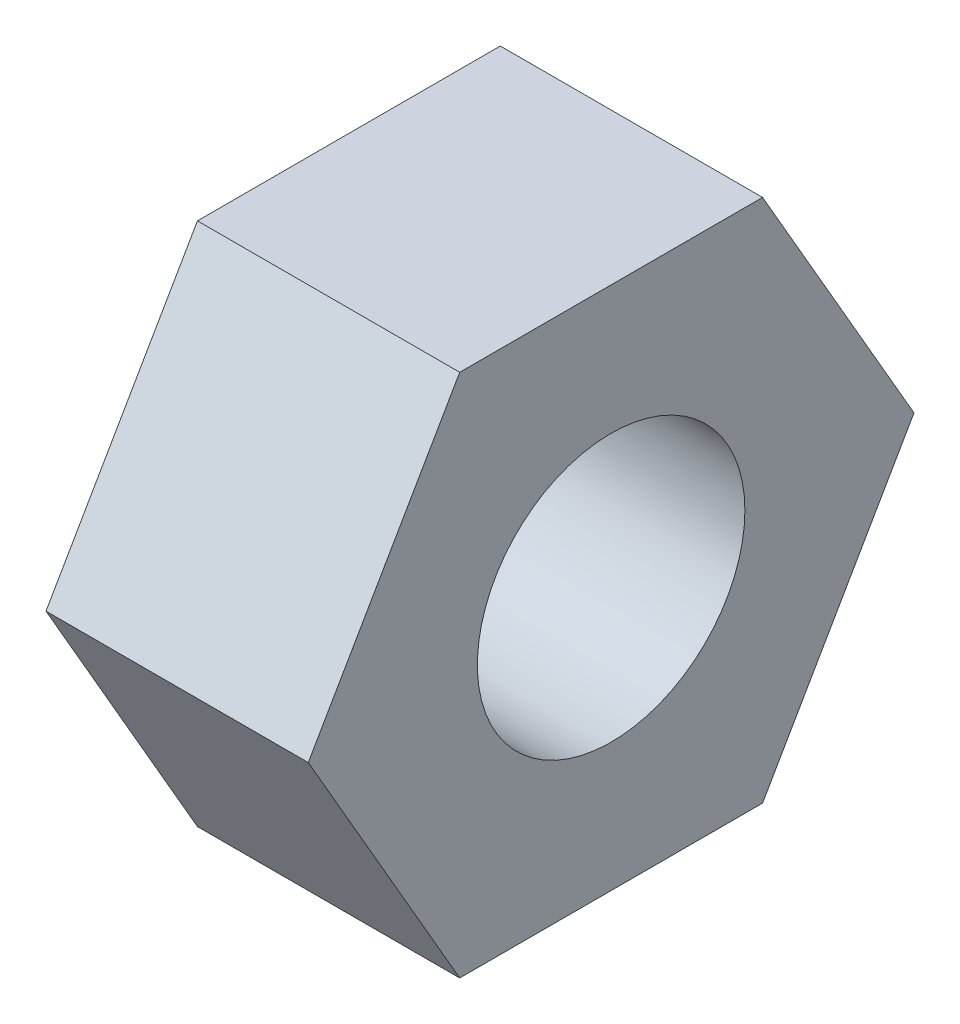
ISO-10303-21;
HEADER;
FILE_DESCRIPTION(('STEP AP214'),'2;1');
FILE_NAME('part.step','',(''),(''),'','','');
FILE_SCHEMA(('AUTOMOTIVE_DESIGN { 1 0 10303 214 1 1 1 1 }'));
ENDSEC;
DATA;
#1=APPLICATION_CONTEXT('core data for automotive mechanical design processes');
#2=APPLICATION_PROTOCOL_DEFINITION('international standard','automotive_design',2000,#1);
#3=PRODUCT_CONTEXT('',#1,'mechanical');
#4=PRODUCT('Part','Part','',(#3));
#5=PRODUCT_RELATED_PRODUCT_CATEGORY('part','',(#4));
#6=PRODUCT_DEFINITION_FORMATION('','',#4);
#7=PRODUCT_DEFINITION_CONTEXT('part definition',#1,'design');
#8=PRODUCT_DEFINITION('design','',#6,#7);
#9=PRODUCT_DEFINITION_SHAPE('','',#8);
#10=(LENGTH_UNIT() NAMED_UNIT(*) SI_UNIT(.MILLI.,.METRE.));
#11=(NAMED_UNIT(*) PLANE_ANGLE_UNIT() SI_UNIT($,.RADIAN.));
#12=(NAMED_UNIT(*) SI_UNIT($,.STERADIAN.) SOLID_ANGLE_UNIT());
#13=UNCERTAINTY_MEASURE_WITH_UNIT(LENGTH_MEASURE(1.E-05),#10,'distance_accuracy_value','');
#14=(GEOMETRIC_REPRESENTATION_CONTEXT(3) GLOBAL_UNCERTAINTY_ASSIGNED_CONTEXT((#13)) GLOBAL_UNIT_ASSIGNED_CONTEXT((#10,
#11,#12)) REPRESENTATION_CONTEXT('',''));
#15=CARTESIAN_POINT('',(0.,0.,0.));
#16=DIRECTION('',(0.,0.,1.));
#17=DIRECTION('',(1.,0.,0.));
#18=AXIS2_PLACEMENT_3D('',#15,#16,#17);
#19=CARTESIAN_POINT('',(10.,0.,0.));
#20=DIRECTION('',(1.,0.,0.));
#21=DIRECTION('',(0.,0.,-1.));
#22=AXIS2_PLACEMENT_3D('',#19,#20,#21);
#23=PLANE('',#22);
#24=DIRECTION('',(0.,0.866025403784441,-0.499999999999995));
#25=VECTOR('',#24,1.);
#26=CARTESIAN_POINT('',(10.,-9.99999999999993,-5.77350269189637));
#27=LINE('',#26,#25);
#28=CARTESIAN_POINT('',(10.,-9.99999999999993,-5.77350269189637));
#29=VERTEX_POINT('',#28);
#30=CARTESIAN_POINT('',(10.,0.,-11.5470053837925));
#31=VERTEX_POINT('',#30);
#32=EDGE_CURVE('E135',#29,#31,#27,.T.);
#33=ORIENTED_EDGE('',*,*,#32,.T.);
#34=DIRECTION('',(0.,0.866025403784438,0.500000000000001));
#35=VECTOR('',#34,1.);
#36=CARTESIAN_POINT('',(10.,0.,-11.5470053837925));
#37=LINE('',#36,#35);
#38=CARTESIAN_POINT('',(10.,10.,-5.77350269189623));
#39=VERTEX_POINT('',#38);
#40=EDGE_CURVE('E93',#31,#39,#37,.T.);
#41=ORIENTED_EDGE('',*,*,#40,.T.);
#42=DIRECTION('',(0.,0.,1.));
#43=VECTOR('',#42,1.);
#44=CARTESIAN_POINT('',(10.,10.,-5.77350269189623));
#45=LINE('',#44,#43);
#46=CARTESIAN_POINT('',(10.,9.99999999999997,5.7735026918963));
#47=VERTEX_POINT('',#46);
#48=EDGE_CURVE('E106',#39,#47,#45,.T.);
#49=ORIENTED_EDGE('',*,*,#48,.T.);
#50=DIRECTION('',(0.,-0.866025403784442,0.499999999999995));
#51=VECTOR('',#50,1.);
#52=CARTESIAN_POINT('',(10.,9.99999999999997,5.7735026918963));
#53=LINE('',#52,#51);
#54=CARTESIAN_POINT('',(10.,0.,11.5470053837925));
#55=VERTEX_POINT('',#54);
#56=EDGE_CURVE('E100',#47,#55,#53,.T.);
#57=ORIENTED_EDGE('',*,*,#56,.T.);
#58=DIRECTION('',(0.,-0.866025403784435,-0.500000000000007));
#59=VECTOR('',#58,1.);
#60=CARTESIAN_POINT('',(10.,0.,11.5470053837925));
#61=LINE('',#60,#59);
#62=CARTESIAN_POINT('',(10.,-10.,5.77350269189616));
#63=VERTEX_POINT('',#62);
#64=EDGE_CURVE('E104',#55,#63,#61,.T.);
#65=ORIENTED_EDGE('',*,*,#64,.T.);
#66=DIRECTION('',(0.,0.,-1.));
#67=VECTOR('',#66,1.);
#68=CARTESIAN_POINT('',(10.,-10.,5.77350269189616));
#69=LINE('',#68,#67);
#70=EDGE_CURVE('E56',#63,#29,#69,.T.);
#71=ORIENTED_EDGE('',*,*,#70,.T.);
#72=EDGE_LOOP('',(#33,#41,#49,#57,#65,#71));
#73=FACE_BOUND('',#72,.T.);
#74=CARTESIAN_POINT('',(10.,0.,0.));
#75=DIRECTION('',(1.,0.,0.));
#76=DIRECTION('',(0.,0.,-1.));
#77=AXIS2_PLACEMENT_3D('',#74,#75,#76);
#78=CIRCLE('',#77,5.1);
#79=CARTESIAN_POINT('',(10.,0.,-5.1));
#80=VERTEX_POINT('',#79);
#81=EDGE_CURVE('E128',#80,#80,#78,.T.);
#82=ORIENTED_EDGE('',*,*,#81,.F.);
#83=EDGE_LOOP('',(#82));
#84=FACE_BOUND('',#83,.T.);
#85=ADVANCED_FACE('F39',(#73,#84),#23,.T.);
#86=CARTESIAN_POINT('',(0.,0.,0.));
#87=DIRECTION('',(1.,0.,0.));
#88=DIRECTION('',(0.,0.,-1.));
#89=AXIS2_PLACEMENT_3D('',#86,#87,#88);
#90=PLANE('',#89);
#91=DIRECTION('',(0.,0.866025403784441,-0.499999999999995));
#92=VECTOR('',#91,1.);
#93=CARTESIAN_POINT('',(0.,-9.99999999999993,-5.77350269189637));
#94=LINE('',#93,#92);
#95=CARTESIAN_POINT('',(0.,-9.99999999999993,-5.77350269189637));
#96=VERTEX_POINT('',#95);
#97=CARTESIAN_POINT('',(0.,0.,-11.5470053837925));
#98=VERTEX_POINT('',#97);
#99=EDGE_CURVE('E124',#96,#98,#94,.T.);
#100=ORIENTED_EDGE('',*,*,#99,.F.);
#101=DIRECTION('',(0.,0.,-1.));
#102=VECTOR('',#101,1.);
#103=CARTESIAN_POINT('',(0.,-10.,5.77350269189616));
#104=LINE('',#103,#102);
#105=CARTESIAN_POINT('',(0.,-10.,5.77350269189616));
#106=VERTEX_POINT('',#105);
#107=EDGE_CURVE('E85',#106,#96,#104,.T.);
#108=ORIENTED_EDGE('',*,*,#107,.F.);
#109=DIRECTION('',(0.,-0.866025403784435,-0.500000000000007));
#110=VECTOR('',#109,1.);
#111=CARTESIAN_POINT('',(0.,0.,11.5470053837925));
#112=LINE('',#111,#110);
#113=CARTESIAN_POINT('',(0.,0.,11.5470053837925));
#114=VERTEX_POINT('',#113);
#115=EDGE_CURVE('E79',#114,#106,#112,.T.);
#116=ORIENTED_EDGE('',*,*,#115,.F.);
#117=DIRECTION('',(0.,-0.866025403784442,0.499999999999995));
#118=VECTOR('',#117,1.);
#119=CARTESIAN_POINT('',(0.,9.99999999999997,5.7735026918963));
#120=LINE('',#119,#118);
#121=CARTESIAN_POINT('',(0.,9.99999999999997,5.7735026918963));
#122=VERTEX_POINT('',#121);
#123=EDGE_CURVE('E114',#122,#114,#120,.T.);
#124=ORIENTED_EDGE('',*,*,#123,.F.);
#125=DIRECTION('',(0.,0.,1.));
#126=VECTOR('',#125,1.);
#127=CARTESIAN_POINT('',(0.,10.,-5.77350269189623));
#128=LINE('',#127,#126);
#129=CARTESIAN_POINT('',(0.,10.,-5.77350269189623));
#130=VERTEX_POINT('',#129);
#131=EDGE_CURVE('E130',#130,#122,#128,.T.);
#132=ORIENTED_EDGE('',*,*,#131,.F.);
#133=DIRECTION('',(0.,0.866025403784438,0.500000000000001));
#134=VECTOR('',#133,1.);
#135=CARTESIAN_POINT('',(0.,0.,-11.5470053837925));
#136=LINE('',#135,#134);
#137=EDGE_CURVE('E127',#98,#130,#136,.T.);
#138=ORIENTED_EDGE('',*,*,#137,.F.);
#139=EDGE_LOOP('',(#100,#108,#116,#124,#132,#138));
#140=FACE_BOUND('',#139,.T.);
#141=CARTESIAN_POINT('',(0.,0.,0.));
#142=DIRECTION('',(1.,0.,0.));
#143=DIRECTION('',(0.,0.,-1.));
#144=AXIS2_PLACEMENT_3D('',#141,#142,#143);
#145=CIRCLE('',#144,5.1);
#146=CARTESIAN_POINT('',(0.,0.,-5.1));
#147=VERTEX_POINT('',#146);
#148=EDGE_CURVE('E246',#147,#147,#145,.T.);
#149=ORIENTED_EDGE('',*,*,#148,.T.);
#150=EDGE_LOOP('',(#149));
#151=FACE_BOUND('',#150,.T.);
#152=ADVANCED_FACE('F144',(#140,#151),#90,.F.);
#153=CARTESIAN_POINT('',(10.,-9.99999999999993,-5.77350269189637));
#154=DIRECTION('',(0.,0.499999999999995,0.866025403784441));
#155=DIRECTION('',(0.,-0.866025403784441,0.499999999999995));
#156=AXIS2_PLACEMENT_3D('',#153,#154,#155);
#157=PLANE('',#156);
#158=ORIENTED_EDGE('',*,*,#99,.T.);
#159=DIRECTION('',(-1.,0.,0.));
#160=VECTOR('',#159,1.);
#161=CARTESIAN_POINT('',(10.,0.,-11.5470053837925));
#162=LINE('',#161,#160);
#163=EDGE_CURVE('E11',#31,#98,#162,.T.);
#164=ORIENTED_EDGE('',*,*,#163,.F.);
#165=ORIENTED_EDGE('',*,*,#32,.F.);
#166=DIRECTION('',(-1.,0.,0.));
#167=VECTOR('',#166,1.);
#168=CARTESIAN_POINT('',(10.,-9.99999999999993,-5.77350269189637));
#169=LINE('',#168,#167);
#170=EDGE_CURVE('E120',#29,#96,#169,.T.);
#171=ORIENTED_EDGE('',*,*,#170,.T.);
#172=EDGE_LOOP('',(#158,#164,#165,#171));
#173=FACE_BOUND('',#172,.T.);
#174=ADVANCED_FACE('F41',(#173),#157,.F.);
#175=CARTESIAN_POINT('',(10.,0.,-11.5470053837925));
#176=DIRECTION('',(0.,-0.500000000000001,0.866025403784438));
#177=DIRECTION('',(0.,-0.866025403784438,-0.500000000000001));
#178=AXIS2_PLACEMENT_3D('',#175,#176,#177);
#179=PLANE('',#178);
#180=ORIENTED_EDGE('',*,*,#137,.T.);
#181=DIRECTION('',(-1.,0.,0.));
#182=VECTOR('',#181,1.);
#183=CARTESIAN_POINT('',(10.,10.,-5.77350269189623));
#184=LINE('',#183,#182);
#185=EDGE_CURVE('E48',#39,#130,#184,.T.);
#186=ORIENTED_EDGE('',*,*,#185,.F.);
#187=ORIENTED_EDGE('',*,*,#40,.F.);
#188=ORIENTED_EDGE('',*,*,#163,.T.);
#189=EDGE_LOOP('',(#180,#186,#187,#188));
#190=FACE_BOUND('',#189,.T.);
#191=ADVANCED_FACE('F169',(#190),#179,.F.);
#192=CARTESIAN_POINT('',(10.,10.,-5.77350269189623));
#193=DIRECTION('',(0.,-1.,0.));
#194=DIRECTION('',(0.,0.,-1.));
#195=AXIS2_PLACEMENT_3D('',#192,#193,#194);
#196=PLANE('',#195);
#197=ORIENTED_EDGE('',*,*,#131,.T.);
#198=DIRECTION('',(-1.,0.,0.));
#199=VECTOR('',#198,1.);
#200=CARTESIAN_POINT('',(10.,9.99999999999997,5.7735026918963));
#201=LINE('',#200,#199);
#202=EDGE_CURVE('E115',#47,#122,#201,.T.);
#203=ORIENTED_EDGE('',*,*,#202,.F.);
#204=ORIENTED_EDGE('',*,*,#48,.F.);
#205=ORIENTED_EDGE('',*,*,#185,.T.);
#206=EDGE_LOOP('',(#197,#203,#204,#205));
#207=FACE_BOUND('',#206,.T.);
#208=ADVANCED_FACE('F141',(#207),#196,.F.);
#209=CARTESIAN_POINT('',(10.,9.99999999999997,5.7735026918963));
#210=DIRECTION('',(0.,-0.499999999999995,-0.866025403784442));
#211=DIRECTION('',(0.,0.866025403784442,-0.499999999999995));
#212=AXIS2_PLACEMENT_3D('',#209,#210,#211);
#213=PLANE('',#212);
#214=ORIENTED_EDGE('',*,*,#123,.T.);
#215=DIRECTION('',(-1.,0.,0.));
#216=VECTOR('',#215,1.);
#217=CARTESIAN_POINT('',(10.,0.,11.5470053837925));
#218=LINE('',#217,#216);
#219=EDGE_CURVE('E111',#55,#114,#218,.T.);
#220=ORIENTED_EDGE('',*,*,#219,.F.);
#221=ORIENTED_EDGE('',*,*,#56,.F.);
#222=ORIENTED_EDGE('',*,*,#202,.T.);
#223=EDGE_LOOP('',(#214,#220,#221,#222));
#224=FACE_BOUND('',#223,.T.);
#225=ADVANCED_FACE('F112',(#224),#213,.F.);
#226=CARTESIAN_POINT('',(10.,0.,11.5470053837925));
#227=DIRECTION('',(0.,0.500000000000007,-0.866025403784434));
#228=DIRECTION('',(0.,0.866025403784435,0.500000000000007));
#229=AXIS2_PLACEMENT_3D('',#226,#227,#228);
#230=PLANE('',#229);
#231=ORIENTED_EDGE('',*,*,#115,.T.);
#232=DIRECTION('',(-1.,0.,0.));
#233=VECTOR('',#232,1.);
#234=CARTESIAN_POINT('',(10.,-10.,5.77350269189616));
#235=LINE('',#234,#233);
#236=EDGE_CURVE('E116',#63,#106,#235,.T.);
#237=ORIENTED_EDGE('',*,*,#236,.F.);
#238=ORIENTED_EDGE('',*,*,#64,.F.);
#239=ORIENTED_EDGE('',*,*,#219,.T.);
#240=EDGE_LOOP('',(#231,#237,#238,#239));
#241=FACE_BOUND('',#240,.T.);
#242=ADVANCED_FACE('F118',(#241),#230,.F.);
#243=CARTESIAN_POINT('',(10.,-10.,5.77350269189616));
#244=DIRECTION('',(0.,1.,0.));
#245=DIRECTION('',(0.,0.,1.));
#246=AXIS2_PLACEMENT_3D('',#243,#244,#245);
#247=PLANE('',#246);
#248=ORIENTED_EDGE('',*,*,#107,.T.);
#249=ORIENTED_EDGE('',*,*,#170,.F.);
#250=ORIENTED_EDGE('',*,*,#70,.F.);
#251=ORIENTED_EDGE('',*,*,#236,.T.);
#252=EDGE_LOOP('',(#248,#249,#250,#251));
#253=FACE_BOUND('',#252,.T.);
#254=ADVANCED_FACE('F149',(#253),#247,.F.);
#255=CARTESIAN_POINT('',(10.,0.,0.));
#256=DIRECTION('',(-1.,0.,0.));
#257=DIRECTION('',(0.,0.,1.));
#258=AXIS2_PLACEMENT_3D('',#255,#256,#257);
#259=CYLINDRICAL_SURFACE('',#258,5.1);
#260=ORIENTED_EDGE('',*,*,#81,.T.);
#261=EDGE_LOOP('',(#260));
#262=FACE_BOUND('',#261,.T.);
#263=ORIENTED_EDGE('',*,*,#148,.F.);
#264=EDGE_LOOP('',(#263));
#265=FACE_BOUND('',#264,.T.);
#266=ADVANCED_FACE('F151',(#262,#265),#259,.F.);
#267=CLOSED_SHELL('',(#85,#152,#174,#191,#208,#225,#242,#254,#266));
#268=MANIFOLD_SOLID_BREP('B2',#267);
#269=ADVANCED_BREP_SHAPE_REPRESENTATION('',(#18,#268),#14);
#270=SHAPE_DEFINITION_REPRESENTATION(#9,#269);
ENDSEC;
END-ISO-10303-21;
